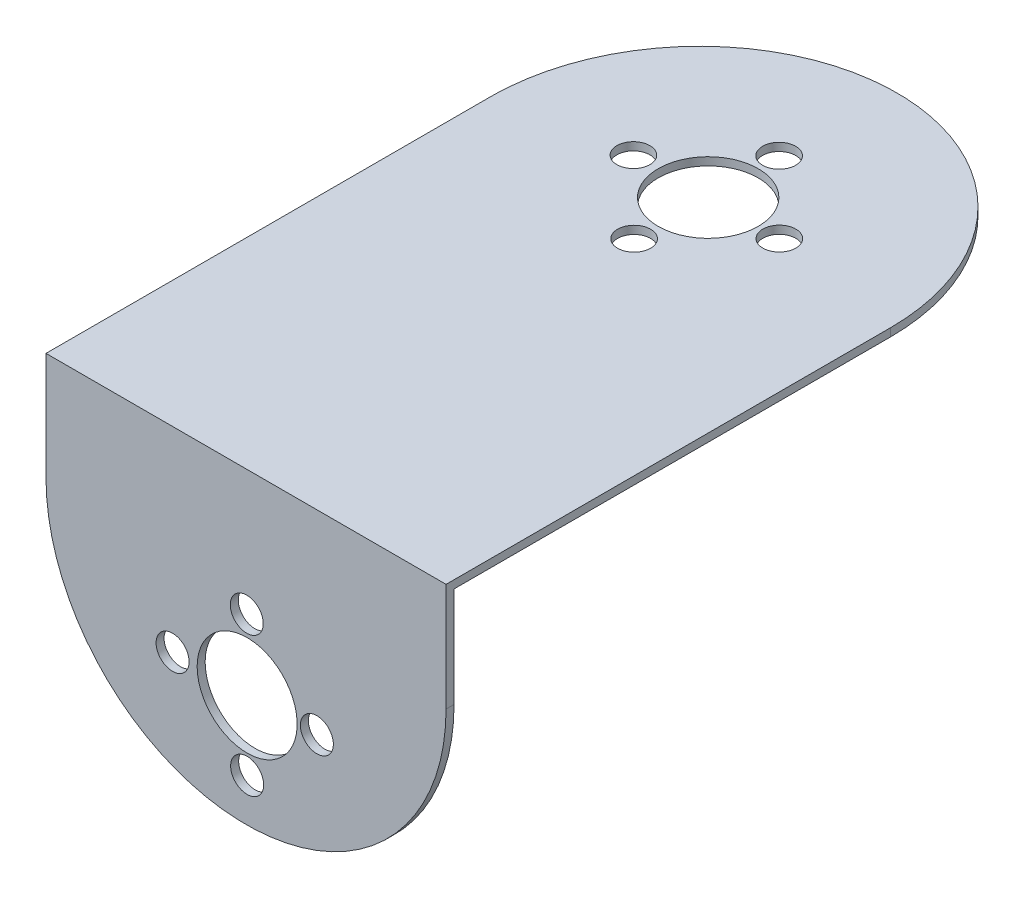
ISO-10303-21;
HEADER;
FILE_DESCRIPTION(('STEP AP214'),'2;1');
FILE_NAME('part.step','',(''),(''),'','','');
FILE_SCHEMA(('AUTOMOTIVE_DESIGN { 1 0 10303 214 1 1 1 1 }'));
ENDSEC;
DATA;
#1=APPLICATION_CONTEXT('core data for automotive mechanical design processes');
#2=APPLICATION_PROTOCOL_DEFINITION('international standard','automotive_design',2000,#1);
#3=PRODUCT_CONTEXT('',#1,'mechanical');
#4=PRODUCT('Part','Part','',(#3));
#5=PRODUCT_RELATED_PRODUCT_CATEGORY('part','',(#4));
#6=PRODUCT_DEFINITION_FORMATION('','',#4);
#7=PRODUCT_DEFINITION_CONTEXT('part definition',#1,'design');
#8=PRODUCT_DEFINITION('design','',#6,#7);
#9=PRODUCT_DEFINITION_SHAPE('','',#8);
#10=(LENGTH_UNIT() NAMED_UNIT(*) SI_UNIT(.MILLI.,.METRE.));
#11=(NAMED_UNIT(*) PLANE_ANGLE_UNIT() SI_UNIT($,.RADIAN.));
#12=(NAMED_UNIT(*) SI_UNIT($,.STERADIAN.) SOLID_ANGLE_UNIT());
#13=UNCERTAINTY_MEASURE_WITH_UNIT(LENGTH_MEASURE(1.E-05),#10,'distance_accuracy_value','');
#14=(GEOMETRIC_REPRESENTATION_CONTEXT(3) GLOBAL_UNCERTAINTY_ASSIGNED_CONTEXT((#13)) GLOBAL_UNIT_ASSIGNED_CONTEXT((#10,
#11,#12)) REPRESENTATION_CONTEXT('',''));
#15=CARTESIAN_POINT('',(0.,0.,0.));
#16=DIRECTION('',(0.,0.,1.));
#17=DIRECTION('',(1.,0.,0.));
#18=AXIS2_PLACEMENT_3D('',#15,#16,#17);
#19=CARTESIAN_POINT('',(-49.9280597014925,0.8,-0.852985074626868));
#20=DIRECTION('',(1.,0.,0.));
#21=DIRECTION('',(0.,0.,-1.));
#22=AXIS2_PLACEMENT_3D('',#19,#20,#21);
#23=PLANE('',#22);
#24=DIRECTION('',(0.,0.,1.));
#25=VECTOR('',#24,1.);
#26=CARTESIAN_POINT('',(-49.9280597014925,0.,-0.852985074626868));
#27=LINE('',#26,#25);
#28=CARTESIAN_POINT('',(-49.9280597014925,0.,-60.8529850746269));
#29=VERTEX_POINT('',#28);
#30=CARTESIAN_POINT('',(-49.9280597014925,0.,-17.2304150486228));
#31=VERTEX_POINT('',#30);
#32=EDGE_CURVE('E170',#29,#31,#27,.T.);
#33=ORIENTED_EDGE('',*,*,#32,.T.);
#34=DIRECTION('',(0.,1.,0.));
#35=VECTOR('',#34,1.);
#36=CARTESIAN_POINT('',(-49.9280597014925,-10.,-17.2304150486229));
#37=LINE('',#36,#35);
#38=CARTESIAN_POINT('',(-49.9280597014925,-10.,-17.2304150486229));
#39=VERTEX_POINT('',#38);
#40=EDGE_CURVE('E116',#39,#31,#37,.T.);
#41=ORIENTED_EDGE('',*,*,#40,.F.);
#42=DIRECTION('',(0.,0.,-1.));
#43=VECTOR('',#42,1.);
#44=CARTESIAN_POINT('',(-49.9280597014925,-10.,-16.4304150486228));
#45=LINE('',#44,#43);
#46=CARTESIAN_POINT('',(-49.9280597014925,-10.,-16.4304150486228));
#47=VERTEX_POINT('',#46);
#48=EDGE_CURVE('E109',#47,#39,#45,.T.);
#49=ORIENTED_EDGE('',*,*,#48,.F.);
#50=DIRECTION('',(0.,-1.,0.));
#51=VECTOR('',#50,1.);
#52=CARTESIAN_POINT('',(-49.9280597014925,10.,-16.4304150486228));
#53=LINE('',#52,#51);
#54=CARTESIAN_POINT('',(-49.9280597014925,0.8,-16.4304150486228));
#55=VERTEX_POINT('',#54);
#56=EDGE_CURVE('E132',#55,#47,#53,.T.);
#57=ORIENTED_EDGE('',*,*,#56,.F.);
#58=DIRECTION('',(0.,0.,1.));
#59=VECTOR('',#58,1.);
#60=CARTESIAN_POINT('',(-49.9280597014925,0.8,-0.852985074626868));
#61=LINE('',#60,#59);
#62=CARTESIAN_POINT('',(-49.9280597014925,0.8,-60.8529850746269));
#63=VERTEX_POINT('',#62);
#64=EDGE_CURVE('E200',#63,#55,#61,.T.);
#65=ORIENTED_EDGE('',*,*,#64,.F.);
#66=DIRECTION('',(0.,-1.,0.));
#67=VECTOR('',#66,1.);
#68=CARTESIAN_POINT('',(-49.9280597014925,0.8,-60.8529850746269));
#69=LINE('',#68,#67);
#70=EDGE_CURVE('E52',#63,#29,#69,.T.);
#71=ORIENTED_EDGE('',*,*,#70,.T.);
#72=EDGE_LOOP('',(#33,#41,#49,#57,#65,#71));
#73=FACE_BOUND('',#72,.T.);
#74=ADVANCED_FACE('F45',(#73),#23,.F.);
#75=CARTESIAN_POINT('',(-9.92805970149253,0.8,-0.852985074626868));
#76=DIRECTION('',(-1.,0.,0.));
#77=DIRECTION('',(0.,0.,1.));
#78=AXIS2_PLACEMENT_3D('',#75,#76,#77);
#79=PLANE('',#78);
#80=DIRECTION('',(0.,0.,-1.));
#81=VECTOR('',#80,1.);
#82=CARTESIAN_POINT('',(-9.92805970149253,0.8,-0.852985074626868));
#83=LINE('',#82,#81);
#84=CARTESIAN_POINT('',(-9.92805970149253,0.8,-16.4304150486228));
#85=VERTEX_POINT('',#84);
#86=CARTESIAN_POINT('',(-9.92805970149253,0.8,-60.8529850746269));
#87=VERTEX_POINT('',#86);
#88=EDGE_CURVE('E203',#85,#87,#83,.T.);
#89=ORIENTED_EDGE('',*,*,#88,.F.);
#90=DIRECTION('',(0.,-1.,0.));
#91=VECTOR('',#90,1.);
#92=CARTESIAN_POINT('',(-9.92805970149253,10.,-16.4304150486228));
#93=LINE('',#92,#91);
#94=CARTESIAN_POINT('',(-9.92805970149253,-10.,-16.4304150486228));
#95=VERTEX_POINT('',#94);
#96=EDGE_CURVE('E104',#85,#95,#93,.T.);
#97=ORIENTED_EDGE('',*,*,#96,.T.);
#98=DIRECTION('',(0.,0.,1.));
#99=VECTOR('',#98,1.);
#100=CARTESIAN_POINT('',(-9.92805970149253,-10.,-16.4304150486228));
#101=LINE('',#100,#99);
#102=CARTESIAN_POINT('',(-9.92805970149252,-10.,-17.2304150486228));
#103=VERTEX_POINT('',#102);
#104=EDGE_CURVE('E98',#103,#95,#101,.T.);
#105=ORIENTED_EDGE('',*,*,#104,.F.);
#106=DIRECTION('',(0.,1.,0.));
#107=VECTOR('',#106,1.);
#108=CARTESIAN_POINT('',(-9.92805970149253,-10.,-17.2304150486228));
#109=LINE('',#108,#107);
#110=CARTESIAN_POINT('',(-9.92805970149253,0.,-17.2304150486228));
#111=VERTEX_POINT('',#110);
#112=EDGE_CURVE('E102',#103,#111,#109,.T.);
#113=ORIENTED_EDGE('',*,*,#112,.T.);
#114=DIRECTION('',(0.,0.,-1.));
#115=VECTOR('',#114,1.);
#116=CARTESIAN_POINT('',(-9.92805970149253,0.,-0.852985074626868));
#117=LINE('',#116,#115);
#118=CARTESIAN_POINT('',(-9.92805970149253,0.,-60.8529850746269));
#119=VERTEX_POINT('',#118);
#120=EDGE_CURVE('E198',#111,#119,#117,.T.);
#121=ORIENTED_EDGE('',*,*,#120,.T.);
#122=DIRECTION('',(0.,-1.,0.));
#123=VECTOR('',#122,1.);
#124=CARTESIAN_POINT('',(-9.92805970149253,0.8,-60.8529850746269));
#125=LINE('',#124,#123);
#126=EDGE_CURVE('E11',#87,#119,#125,.T.);
#127=ORIENTED_EDGE('',*,*,#126,.F.);
#128=EDGE_LOOP('',(#89,#97,#105,#113,#121,#127));
#129=FACE_BOUND('',#128,.T.);
#130=ADVANCED_FACE('F101',(#129),#79,.F.);
#131=CARTESIAN_POINT('',(0.,0.8,0.));
#132=DIRECTION('',(0.,-1.,0.));
#133=DIRECTION('',(0.,0.,-1.));
#134=AXIS2_PLACEMENT_3D('',#131,#132,#133);
#135=PLANE('',#134);
#136=ORIENTED_EDGE('',*,*,#64,.T.);
#137=DIRECTION('',(1.,0.,0.));
#138=VECTOR('',#137,1.);
#139=CARTESIAN_POINT('',(0.,0.8,-16.4304150486228));
#140=LINE('',#139,#138);
#141=EDGE_CURVE('E134',#55,#85,#140,.T.);
#142=ORIENTED_EDGE('',*,*,#141,.T.);
#143=ORIENTED_EDGE('',*,*,#88,.T.);
#144=CARTESIAN_POINT('',(-29.9280597014925,0.8,-60.8529850746269));
#145=DIRECTION('',(0.,1.,0.));
#146=DIRECTION('',(0.,0.,-1.));
#147=AXIS2_PLACEMENT_3D('',#144,#145,#146);
#148=ELLIPSE('',#147,20.6728644389965,20.);
#149=EDGE_CURVE('E67',#87,#63,#148,.T.);
#150=ORIENTED_EDGE('',*,*,#149,.T.);
#151=EDGE_LOOP('',(#136,#142,#143,#150));
#152=FACE_BOUND('',#151,.T.);
#153=CARTESIAN_POINT('',(-23.2059106646241,0.8,-63.0298731059727));
#154=DIRECTION('',(0.,1.,0.));
#155=DIRECTION('',(0.,0.,1.));
#156=AXIS2_PLACEMENT_3D('',#153,#154,#155);
#157=CIRCLE('',#156,1.65);
#158=CARTESIAN_POINT('',(-23.2059106646241,0.8,-61.3798731059727));
#159=VERTEX_POINT('',#158);
#160=EDGE_CURVE('E144',#159,#159,#157,.T.);
#161=ORIENTED_EDGE('',*,*,#160,.F.);
#162=EDGE_LOOP('',(#161));
#163=FACE_BOUND('',#162,.T.);
#164=CARTESIAN_POINT('',(-37.7263655385622,0.8,-62.9611713784013));
#165=DIRECTION('',(0.,1.,0.));
#166=DIRECTION('',(0.,0.,1.));
#167=AXIS2_PLACEMENT_3D('',#164,#165,#166);
#168=CIRCLE('',#167,1.65);
#169=CARTESIAN_POINT('',(-37.7263655385622,0.8,-61.3111713784013));
#170=VERTEX_POINT('',#169);
#171=EDGE_CURVE('E162',#170,#170,#168,.T.);
#172=ORIENTED_EDGE('',*,*,#171,.F.);
#173=EDGE_LOOP('',(#172));
#174=FACE_BOUND('',#173,.T.);
#175=CARTESIAN_POINT('',(-30.3859009535512,0.8,-70.1928156618199));
#176=DIRECTION('',(0.,1.,0.));
#177=DIRECTION('',(0.,0.,1.));
#178=AXIS2_PLACEMENT_3D('',#175,#176,#177);
#179=CIRCLE('',#178,1.65);
#180=CARTESIAN_POINT('',(-30.3859009535512,0.8,-68.54281566182));
#181=VERTEX_POINT('',#180);
#182=EDGE_CURVE('E145',#181,#181,#179,.T.);
#183=ORIENTED_EDGE('',*,*,#182,.F.);
#184=EDGE_LOOP('',(#183));
#185=FACE_BOUND('',#184,.T.);
#186=CARTESIAN_POINT('',(-30.3171992259798,0.8,-63.0298731059727));
#187=DIRECTION('',(0.,1.,0.));
#188=DIRECTION('',(0.,0.,1.));
#189=AXIS2_PLACEMENT_3D('',#186,#187,#188);
#190=CIRCLE('',#189,5.);
#191=CARTESIAN_POINT('',(-30.3171992259798,0.8,-58.0298731059727));
#192=VERTEX_POINT('',#191);
#193=EDGE_CURVE('E152',#192,#192,#190,.T.);
#194=ORIENTED_EDGE('',*,*,#193,.F.);
#195=EDGE_LOOP('',(#194));
#196=FACE_BOUND('',#195,.T.);
#197=CARTESIAN_POINT('',(-30.4546026811226,0.8,-55.7581102485331));
#198=DIRECTION('',(0.,1.,0.));
#199=DIRECTION('',(0.,0.,1.));
#200=AXIS2_PLACEMENT_3D('',#197,#198,#199);
#201=CIRCLE('',#200,1.65);
#202=CARTESIAN_POINT('',(-30.4546026811226,0.8,-54.1081102485331));
#203=VERTEX_POINT('',#202);
#204=EDGE_CURVE('E141',#203,#203,#201,.T.);
#205=ORIENTED_EDGE('',*,*,#204,.F.);
#206=EDGE_LOOP('',(#205));
#207=FACE_BOUND('',#206,.T.);
#208=ADVANCED_FACE('F182',(#152,#163,#174,#185,#196,#207),#135,.F.);
#209=CARTESIAN_POINT('',(0.,0.,0.));
#210=DIRECTION('',(0.,-1.,0.));
#211=DIRECTION('',(0.,0.,-1.));
#212=AXIS2_PLACEMENT_3D('',#209,#210,#211);
#213=PLANE('',#212);
#214=DIRECTION('',(1.,0.,0.));
#215=VECTOR('',#214,1.);
#216=CARTESIAN_POINT('',(-49.9280597014925,0.,-17.2304150486229));
#217=LINE('',#216,#215);
#218=EDGE_CURVE('E59',#31,#111,#217,.T.);
#219=ORIENTED_EDGE('',*,*,#218,.F.);
#220=ORIENTED_EDGE('',*,*,#32,.F.);
#221=CARTESIAN_POINT('',(-29.9280597014925,0.,-60.8529850746269));
#222=DIRECTION('',(0.,1.,0.));
#223=DIRECTION('',(0.,0.,-1.));
#224=AXIS2_PLACEMENT_3D('',#221,#222,#223);
#225=ELLIPSE('',#224,20.6728644389965,20.);
#226=EDGE_CURVE('E167',#119,#29,#225,.T.);
#227=ORIENTED_EDGE('',*,*,#226,.F.);
#228=ORIENTED_EDGE('',*,*,#120,.F.);
#229=EDGE_LOOP('',(#219,#220,#227,#228));
#230=FACE_BOUND('',#229,.T.);
#231=CARTESIAN_POINT('',(-30.4546026811226,0.,-55.7581102485331));
#232=DIRECTION('',(0.,1.,0.));
#233=DIRECTION('',(0.,0.,1.));
#234=AXIS2_PLACEMENT_3D('',#231,#232,#233);
#235=CIRCLE('',#234,1.65);
#236=CARTESIAN_POINT('',(-30.4546026811226,0.,-54.1081102485331));
#237=VERTEX_POINT('',#236);
#238=EDGE_CURVE('E138',#237,#237,#235,.T.);
#239=ORIENTED_EDGE('',*,*,#238,.T.);
#240=EDGE_LOOP('',(#239));
#241=FACE_BOUND('',#240,.T.);
#242=CARTESIAN_POINT('',(-30.3171992259798,0.,-63.0298731059727));
#243=DIRECTION('',(0.,1.,0.));
#244=DIRECTION('',(0.,0.,1.));
#245=AXIS2_PLACEMENT_3D('',#242,#243,#244);
#246=CIRCLE('',#245,5.);
#247=CARTESIAN_POINT('',(-30.3171992259798,0.,-58.0298731059727));
#248=VERTEX_POINT('',#247);
#249=EDGE_CURVE('E137',#248,#248,#246,.T.);
#250=ORIENTED_EDGE('',*,*,#249,.T.);
#251=EDGE_LOOP('',(#250));
#252=FACE_BOUND('',#251,.T.);
#253=CARTESIAN_POINT('',(-30.3859009535512,0.,-70.1928156618199));
#254=DIRECTION('',(0.,1.,0.));
#255=DIRECTION('',(0.,0.,1.));
#256=AXIS2_PLACEMENT_3D('',#253,#254,#255);
#257=CIRCLE('',#256,1.65);
#258=CARTESIAN_POINT('',(-30.3859009535512,0.,-68.54281566182));
#259=VERTEX_POINT('',#258);
#260=EDGE_CURVE('E149',#259,#259,#257,.T.);
#261=ORIENTED_EDGE('',*,*,#260,.T.);
#262=EDGE_LOOP('',(#261));
#263=FACE_BOUND('',#262,.T.);
#264=CARTESIAN_POINT('',(-37.7263655385622,0.,-62.9611713784013));
#265=DIRECTION('',(0.,1.,0.));
#266=DIRECTION('',(0.,0.,1.));
#267=AXIS2_PLACEMENT_3D('',#264,#265,#266);
#268=CIRCLE('',#267,1.65);
#269=CARTESIAN_POINT('',(-37.7263655385622,0.,-61.3111713784013));
#270=VERTEX_POINT('',#269);
#271=EDGE_CURVE('E148',#270,#270,#268,.T.);
#272=ORIENTED_EDGE('',*,*,#271,.T.);
#273=EDGE_LOOP('',(#272));
#274=FACE_BOUND('',#273,.T.);
#275=CARTESIAN_POINT('',(-23.2059106646241,0.,-63.0298731059727));
#276=DIRECTION('',(0.,1.,0.));
#277=DIRECTION('',(0.,0.,1.));
#278=AXIS2_PLACEMENT_3D('',#275,#276,#277);
#279=CIRCLE('',#278,1.65);
#280=CARTESIAN_POINT('',(-23.2059106646241,0.,-61.3798731059727));
#281=VERTEX_POINT('',#280);
#282=EDGE_CURVE('E159',#281,#281,#279,.T.);
#283=ORIENTED_EDGE('',*,*,#282,.T.);
#284=EDGE_LOOP('',(#283));
#285=FACE_BOUND('',#284,.T.);
#286=ADVANCED_FACE('F178',(#230,#241,#252,#263,#274,#285),#213,.T.);
#287=DIRECTION('',(0.,1.,0.));
#288=VECTOR('',#287,1.);
#289=SURFACE_OF_LINEAR_EXTRUSION('',#225,#288);
#290=ORIENTED_EDGE('',*,*,#126,.T.);
#291=ORIENTED_EDGE('',*,*,#226,.T.);
#292=ORIENTED_EDGE('',*,*,#70,.F.);
#293=ORIENTED_EDGE('',*,*,#149,.F.);
#294=EDGE_LOOP('',(#290,#291,#292,#293));
#295=FACE_BOUND('',#294,.T.);
#296=ADVANCED_FACE('F173',(#295),#289,.T.);
#297=CARTESIAN_POINT('',(-23.2059106646241,0.,-63.0298731059727));
#298=DIRECTION('',(0.,1.,0.));
#299=DIRECTION('',(0.,0.,1.));
#300=AXIS2_PLACEMENT_3D('',#297,#298,#299);
#301=CYLINDRICAL_SURFACE('',#300,1.65);
#302=ORIENTED_EDGE('',*,*,#282,.F.);
#303=EDGE_LOOP('',(#302));
#304=FACE_BOUND('',#303,.T.);
#305=ORIENTED_EDGE('',*,*,#160,.T.);
#306=EDGE_LOOP('',(#305));
#307=FACE_BOUND('',#306,.T.);
#308=ADVANCED_FACE('F177',(#304,#307),#301,.F.);
#309=CARTESIAN_POINT('',(-37.7263655385622,0.,-62.9611713784013));
#310=DIRECTION('',(0.,1.,0.));
#311=DIRECTION('',(0.,0.,1.));
#312=AXIS2_PLACEMENT_3D('',#309,#310,#311);
#313=CYLINDRICAL_SURFACE('',#312,1.65);
#314=ORIENTED_EDGE('',*,*,#271,.F.);
#315=EDGE_LOOP('',(#314));
#316=FACE_BOUND('',#315,.T.);
#317=ORIENTED_EDGE('',*,*,#171,.T.);
#318=EDGE_LOOP('',(#317));
#319=FACE_BOUND('',#318,.T.);
#320=ADVANCED_FACE('F180',(#316,#319),#313,.F.);
#321=CARTESIAN_POINT('',(-30.3859009535512,0.,-70.1928156618199));
#322=DIRECTION('',(0.,1.,0.));
#323=DIRECTION('',(0.,0.,1.));
#324=AXIS2_PLACEMENT_3D('',#321,#322,#323);
#325=CYLINDRICAL_SURFACE('',#324,1.65);
#326=ORIENTED_EDGE('',*,*,#260,.F.);
#327=EDGE_LOOP('',(#326));
#328=FACE_BOUND('',#327,.T.);
#329=ORIENTED_EDGE('',*,*,#182,.T.);
#330=EDGE_LOOP('',(#329));
#331=FACE_BOUND('',#330,.T.);
#332=ADVANCED_FACE('F243',(#328,#331),#325,.F.);
#333=CARTESIAN_POINT('',(-30.3171992259798,0.,-63.0298731059727));
#334=DIRECTION('',(0.,1.,0.));
#335=DIRECTION('',(0.,0.,1.));
#336=AXIS2_PLACEMENT_3D('',#333,#334,#335);
#337=CYLINDRICAL_SURFACE('',#336,5.);
#338=ORIENTED_EDGE('',*,*,#249,.F.);
#339=EDGE_LOOP('',(#338));
#340=FACE_BOUND('',#339,.T.);
#341=ORIENTED_EDGE('',*,*,#193,.T.);
#342=EDGE_LOOP('',(#341));
#343=FACE_BOUND('',#342,.T.);
#344=ADVANCED_FACE('F234',(#340,#343),#337,.F.);
#345=CARTESIAN_POINT('',(-30.4546026811226,0.,-55.7581102485331));
#346=DIRECTION('',(0.,1.,0.));
#347=DIRECTION('',(0.,0.,1.));
#348=AXIS2_PLACEMENT_3D('',#345,#346,#347);
#349=CYLINDRICAL_SURFACE('',#348,1.65);
#350=ORIENTED_EDGE('',*,*,#238,.F.);
#351=EDGE_LOOP('',(#350));
#352=FACE_BOUND('',#351,.T.);
#353=ORIENTED_EDGE('',*,*,#204,.T.);
#354=EDGE_LOOP('',(#353));
#355=FACE_BOUND('',#354,.T.);
#356=ADVANCED_FACE('F233',(#352,#355),#349,.F.);
#357=CARTESIAN_POINT('',(-49.9280597014925,10.,-16.4304150486228));
#358=DIRECTION('',(0.,0.,-1.));
#359=DIRECTION('',(-1.,0.,0.));
#360=AXIS2_PLACEMENT_3D('',#357,#358,#359);
#361=PLANE('',#360);
#362=CARTESIAN_POINT('',(-29.8535120266186,-11.7485514360716,-16.4304150486228));
#363=DIRECTION('',(0.,0.,-1.));
#364=DIRECTION('',(-1.,0.,0.));
#365=AXIS2_PLACEMENT_3D('',#362,#363,#364);
#366=CIRCLE('',#365,1.65000000000001);
#367=CARTESIAN_POINT('',(-31.5035120266186,-11.7485514360716,-16.4304150486228));
#368=VERTEX_POINT('',#367);
#369=EDGE_CURVE('E122',#368,#368,#366,.T.);
#370=ORIENTED_EDGE('',*,*,#369,.T.);
#371=EDGE_LOOP('',(#370));
#372=FACE_BOUND('',#371,.T.);
#373=CARTESIAN_POINT('',(-37.2710056765767,-18.756032874223,-16.4304150486228));
#374=DIRECTION('',(0.,0.,-1.));
#375=DIRECTION('',(-1.,0.,0.));
#376=AXIS2_PLACEMENT_3D('',#373,#374,#375);
#377=CIRCLE('',#376,1.65);
#378=CARTESIAN_POINT('',(-38.9210056765767,-18.756032874223,-16.4304150486228));
#379=VERTEX_POINT('',#378);
#380=EDGE_CURVE('E126',#379,#379,#377,.T.);
#381=ORIENTED_EDGE('',*,*,#380,.T.);
#382=EDGE_LOOP('',(#381));
#383=FACE_BOUND('',#382,.T.);
#384=CARTESIAN_POINT('',(-29.8162381891816,-25.6889666375005,-16.4304150486228));
#385=DIRECTION('',(0.,0.,-1.));
#386=DIRECTION('',(-1.,0.,0.));
#387=AXIS2_PLACEMENT_3D('',#384,#385,#386);
#388=CIRCLE('',#387,1.65000000000001);
#389=CARTESIAN_POINT('',(-31.4662381891816,-25.6889666375005,-16.4304150486228));
#390=VERTEX_POINT('',#389);
#391=EDGE_CURVE('E381',#390,#390,#388,.T.);
#392=ORIENTED_EDGE('',*,*,#391,.T.);
#393=EDGE_LOOP('',(#392));
#394=FACE_BOUND('',#393,.T.);
#395=CARTESIAN_POINT('',(-22.8460305884672,-18.6814851993491,-16.4304150486228));
#396=DIRECTION('',(0.,0.,-1.));
#397=DIRECTION('',(-1.,0.,0.));
#398=AXIS2_PLACEMENT_3D('',#395,#396,#397);
#399=CIRCLE('',#398,1.65);
#400=CARTESIAN_POINT('',(-24.4960305884672,-18.6814851993491,-16.4304150486228));
#401=VERTEX_POINT('',#400);
#402=EDGE_CURVE('E374',#401,#401,#399,.T.);
#403=ORIENTED_EDGE('',*,*,#402,.T.);
#404=EDGE_LOOP('',(#403));
#405=FACE_BOUND('',#404,.T.);
#406=CARTESIAN_POINT('',(-29.8162381891816,-18.756032874223,-16.4304150486228));
#407=DIRECTION('',(0.,0.,-1.));
#408=DIRECTION('',(-1.,0.,0.));
#409=AXIS2_PLACEMENT_3D('',#406,#407,#408);
#410=CIRCLE('',#409,5.);
#411=CARTESIAN_POINT('',(-34.8162381891816,-18.756032874223,-16.4304150486228));
#412=VERTEX_POINT('',#411);
#413=EDGE_CURVE('E371',#412,#412,#410,.T.);
#414=ORIENTED_EDGE('',*,*,#413,.T.);
#415=EDGE_LOOP('',(#414));
#416=FACE_BOUND('',#415,.T.);
#417=ORIENTED_EDGE('',*,*,#96,.F.);
#418=ORIENTED_EDGE('',*,*,#141,.F.);
#419=ORIENTED_EDGE('',*,*,#56,.T.);
#420=CARTESIAN_POINT('',(-29.9280597014925,-10.,-16.4304150486228));
#421=DIRECTION('',(0.,0.,-1.));
#422=DIRECTION('',(-1.,0.,0.));
#423=AXIS2_PLACEMENT_3D('',#420,#421,#422);
#424=CIRCLE('',#423,20.);
#425=EDGE_CURVE('E121',#95,#47,#424,.T.);
#426=ORIENTED_EDGE('',*,*,#425,.F.);
#427=EDGE_LOOP('',(#417,#418,#419,#426));
#428=FACE_BOUND('',#427,.T.);
#429=ADVANCED_FACE('F208',(#372,#383,#394,#405,#416,#428),#361,.F.);
#430=CARTESIAN_POINT('',(-49.9280597014925,-10.,-17.2304150486229));
#431=DIRECTION('',(0.,0.,1.));
#432=DIRECTION('',(1.,0.,0.));
#433=AXIS2_PLACEMENT_3D('',#430,#431,#432);
#434=PLANE('',#433);
#435=CARTESIAN_POINT('',(-29.8535120266186,-11.7485514360716,-17.2304150486228));
#436=DIRECTION('',(0.,0.,-1.));
#437=DIRECTION('',(-1.,0.,0.));
#438=AXIS2_PLACEMENT_3D('',#435,#436,#437);
#439=CIRCLE('',#438,1.65000000000001);
#440=CARTESIAN_POINT('',(-31.5035120266186,-11.7485514360716,-17.2304150486228));
#441=VERTEX_POINT('',#440);
#442=EDGE_CURVE('E355',#441,#441,#439,.T.);
#443=ORIENTED_EDGE('',*,*,#442,.F.);
#444=EDGE_LOOP('',(#443));
#445=FACE_BOUND('',#444,.T.);
#446=CARTESIAN_POINT('',(-37.2710056765767,-18.756032874223,-17.2304150486229));
#447=DIRECTION('',(0.,0.,-1.));
#448=DIRECTION('',(-1.,0.,0.));
#449=AXIS2_PLACEMENT_3D('',#446,#447,#448);
#450=CIRCLE('',#449,1.65);
#451=CARTESIAN_POINT('',(-38.9210056765767,-18.756032874223,-17.2304150486229));
#452=VERTEX_POINT('',#451);
#453=EDGE_CURVE('E359',#452,#452,#450,.T.);
#454=ORIENTED_EDGE('',*,*,#453,.F.);
#455=EDGE_LOOP('',(#454));
#456=FACE_BOUND('',#455,.T.);
#457=CARTESIAN_POINT('',(-29.8162381891816,-25.6889666375005,-17.2304150486228));
#458=DIRECTION('',(0.,0.,-1.));
#459=DIRECTION('',(-1.,0.,0.));
#460=AXIS2_PLACEMENT_3D('',#457,#458,#459);
#461=CIRCLE('',#460,1.65000000000001);
#462=CARTESIAN_POINT('',(-31.4662381891816,-25.6889666375005,-17.2304150486228));
#463=VERTEX_POINT('',#462);
#464=EDGE_CURVE('E363',#463,#463,#461,.T.);
#465=ORIENTED_EDGE('',*,*,#464,.F.);
#466=EDGE_LOOP('',(#465));
#467=FACE_BOUND('',#466,.T.);
#468=CARTESIAN_POINT('',(-22.8460305884672,-18.6814851993491,-17.2304150486228));
#469=DIRECTION('',(0.,0.,-1.));
#470=DIRECTION('',(-1.,0.,0.));
#471=AXIS2_PLACEMENT_3D('',#468,#469,#470);
#472=CIRCLE('',#471,1.65);
#473=CARTESIAN_POINT('',(-24.4960305884672,-18.6814851993491,-17.2304150486228));
#474=VERTEX_POINT('',#473);
#475=EDGE_CURVE('E367',#474,#474,#472,.T.);
#476=ORIENTED_EDGE('',*,*,#475,.F.);
#477=EDGE_LOOP('',(#476));
#478=FACE_BOUND('',#477,.T.);
#479=CARTESIAN_POINT('',(-29.8162381891816,-18.756032874223,-17.2304150486228));
#480=DIRECTION('',(0.,0.,-1.));
#481=DIRECTION('',(-1.,0.,0.));
#482=AXIS2_PLACEMENT_3D('',#479,#480,#481);
#483=CIRCLE('',#482,5.);
#484=CARTESIAN_POINT('',(-34.8162381891816,-18.756032874223,-17.2304150486228));
#485=VERTEX_POINT('',#484);
#486=EDGE_CURVE('E370',#485,#485,#483,.T.);
#487=ORIENTED_EDGE('',*,*,#486,.F.);
#488=EDGE_LOOP('',(#487));
#489=FACE_BOUND('',#488,.T.);
#490=ORIENTED_EDGE('',*,*,#218,.T.);
#491=ORIENTED_EDGE('',*,*,#112,.F.);
#492=CARTESIAN_POINT('',(-29.9280597014925,-10.,-17.2304150486228));
#493=DIRECTION('',(0.,0.,-1.));
#494=DIRECTION('',(-1.,0.,0.));
#495=AXIS2_PLACEMENT_3D('',#492,#493,#494);
#496=CIRCLE('',#495,20.);
#497=EDGE_CURVE('E115',#103,#39,#496,.T.);
#498=ORIENTED_EDGE('',*,*,#497,.T.);
#499=ORIENTED_EDGE('',*,*,#40,.T.);
#500=EDGE_LOOP('',(#490,#491,#498,#499));
#501=FACE_BOUND('',#500,.T.);
#502=ADVANCED_FACE('F113',(#445,#456,#467,#478,#489,#501),#434,.F.);
#503=CARTESIAN_POINT('',(-29.9280597014925,-10.,-16.4304150486228));
#504=DIRECTION('',(0.,0.,-1.));
#505=DIRECTION('',(-1.,0.,0.));
#506=AXIS2_PLACEMENT_3D('',#503,#504,#505);
#507=CYLINDRICAL_SURFACE('',#506,20.);
#508=ORIENTED_EDGE('',*,*,#425,.T.);
#509=ORIENTED_EDGE('',*,*,#48,.T.);
#510=ORIENTED_EDGE('',*,*,#497,.F.);
#511=ORIENTED_EDGE('',*,*,#104,.T.);
#512=EDGE_LOOP('',(#508,#509,#510,#511));
#513=FACE_BOUND('',#512,.T.);
#514=ADVANCED_FACE('F119',(#513),#507,.T.);
#515=CARTESIAN_POINT('',(-29.8162381891816,-18.756032874223,-7.43041504862285));
#516=DIRECTION('',(0.,0.,-1.));
#517=DIRECTION('',(-1.,0.,0.));
#518=AXIS2_PLACEMENT_3D('',#515,#516,#517);
#519=CYLINDRICAL_SURFACE('',#518,5.);
#520=ORIENTED_EDGE('',*,*,#486,.T.);
#521=EDGE_LOOP('',(#520));
#522=FACE_BOUND('',#521,.T.);
#523=ORIENTED_EDGE('',*,*,#413,.F.);
#524=EDGE_LOOP('',(#523));
#525=FACE_BOUND('',#524,.T.);
#526=ADVANCED_FACE('F298',(#522,#525),#519,.F.);
#527=CARTESIAN_POINT('',(-22.8460305884672,-18.6814851993491,-7.43041504862285));
#528=DIRECTION('',(0.,0.,-1.));
#529=DIRECTION('',(-1.,0.,0.));
#530=AXIS2_PLACEMENT_3D('',#527,#528,#529);
#531=CYLINDRICAL_SURFACE('',#530,1.65);
#532=ORIENTED_EDGE('',*,*,#475,.T.);
#533=EDGE_LOOP('',(#532));
#534=FACE_BOUND('',#533,.T.);
#535=ORIENTED_EDGE('',*,*,#402,.F.);
#536=EDGE_LOOP('',(#535));
#537=FACE_BOUND('',#536,.T.);
#538=ADVANCED_FACE('F304',(#534,#537),#531,.F.);
#539=CARTESIAN_POINT('',(-29.8162381891816,-25.6889666375005,-7.43041504862285));
#540=DIRECTION('',(0.,0.,-1.));
#541=DIRECTION('',(-1.,0.,0.));
#542=AXIS2_PLACEMENT_3D('',#539,#540,#541);
#543=CYLINDRICAL_SURFACE('',#542,1.65000000000001);
#544=ORIENTED_EDGE('',*,*,#464,.T.);
#545=EDGE_LOOP('',(#544));
#546=FACE_BOUND('',#545,.T.);
#547=ORIENTED_EDGE('',*,*,#391,.F.);
#548=EDGE_LOOP('',(#547));
#549=FACE_BOUND('',#548,.T.);
#550=ADVANCED_FACE('F315',(#546,#549),#543,.F.);
#551=CARTESIAN_POINT('',(-37.2710056765767,-18.756032874223,-7.43041504862285));
#552=DIRECTION('',(0.,0.,-1.));
#553=DIRECTION('',(-1.,0.,0.));
#554=AXIS2_PLACEMENT_3D('',#551,#552,#553);
#555=CYLINDRICAL_SURFACE('',#554,1.65);
#556=ORIENTED_EDGE('',*,*,#453,.T.);
#557=EDGE_LOOP('',(#556));
#558=FACE_BOUND('',#557,.T.);
#559=ORIENTED_EDGE('',*,*,#380,.F.);
#560=EDGE_LOOP('',(#559));
#561=FACE_BOUND('',#560,.T.);
#562=ADVANCED_FACE('F325',(#558,#561),#555,.F.);
#563=CARTESIAN_POINT('',(-29.8535120266186,-11.7485514360716,-7.43041504862285));
#564=DIRECTION('',(0.,0.,-1.));
#565=DIRECTION('',(-1.,0.,0.));
#566=AXIS2_PLACEMENT_3D('',#563,#564,#565);
#567=CYLINDRICAL_SURFACE('',#566,1.65000000000001);
#568=ORIENTED_EDGE('',*,*,#442,.T.);
#569=EDGE_LOOP('',(#568));
#570=FACE_BOUND('',#569,.T.);
#571=ORIENTED_EDGE('',*,*,#369,.F.);
#572=EDGE_LOOP('',(#571));
#573=FACE_BOUND('',#572,.T.);
#574=ADVANCED_FACE('F335',(#570,#573),#567,.F.);
#575=CLOSED_SHELL('',(#74,#130,#208,#286,#296,#308,#320,#332,#344,#356,#429,#502,#514,#526,#538,
#550,#562,#574));
#576=MANIFOLD_SOLID_BREP('B2',#575);
#577=ADVANCED_BREP_SHAPE_REPRESENTATION('',(#18,#576),#14);
#578=SHAPE_DEFINITION_REPRESENTATION(#9,#577);
ENDSEC;
END-ISO-10303-21;
